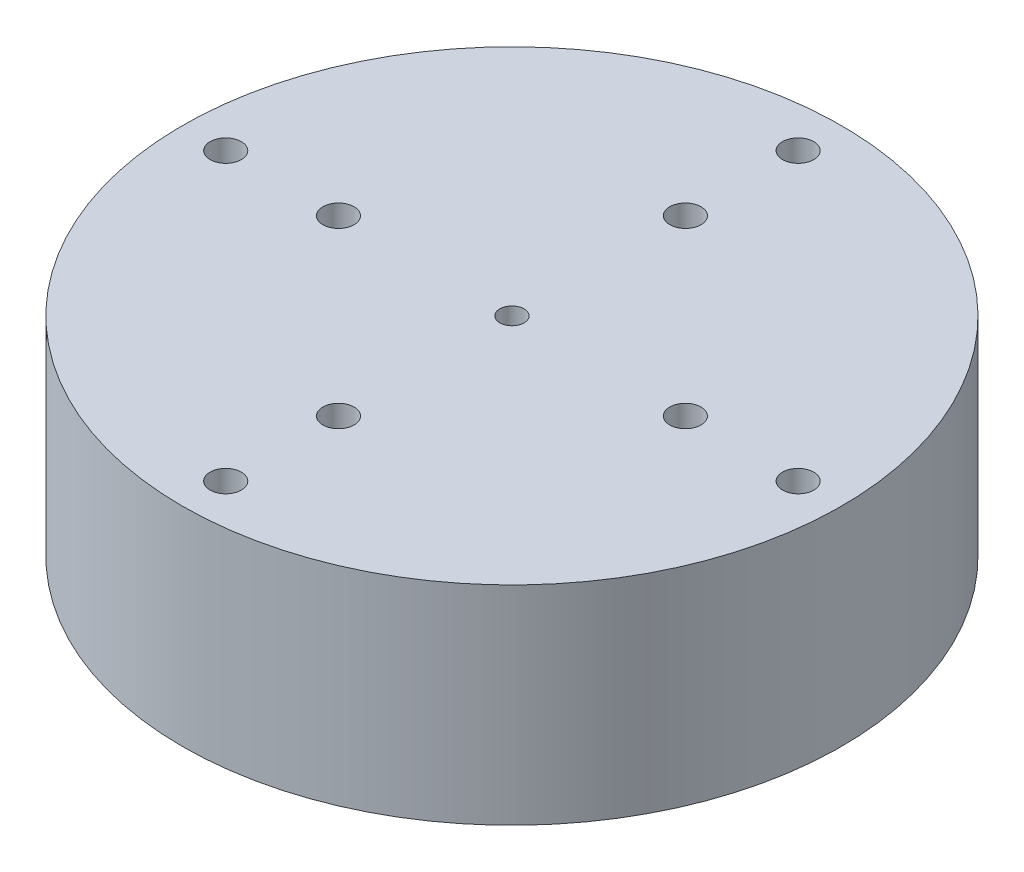
ISO-10303-21;
HEADER;
FILE_DESCRIPTION(('STEP AP214'),'2;1');
FILE_NAME('part.step','',(''),(''),'','','');
FILE_SCHEMA(('AUTOMOTIVE_DESIGN { 1 0 10303 214 1 1 1 1 }'));
ENDSEC;
DATA;
#1=APPLICATION_CONTEXT('core data for automotive mechanical design processes');
#2=APPLICATION_PROTOCOL_DEFINITION('international standard','automotive_design',2000,#1);
#3=PRODUCT_CONTEXT('',#1,'mechanical');
#4=PRODUCT('Part','Part','',(#3));
#5=PRODUCT_RELATED_PRODUCT_CATEGORY('part','',(#4));
#6=PRODUCT_DEFINITION_FORMATION('','',#4);
#7=PRODUCT_DEFINITION_CONTEXT('part definition',#1,'design');
#8=PRODUCT_DEFINITION('design','',#6,#7);
#9=PRODUCT_DEFINITION_SHAPE('','',#8);
#10=(LENGTH_UNIT() NAMED_UNIT(*) SI_UNIT(.MILLI.,.METRE.));
#11=(NAMED_UNIT(*) PLANE_ANGLE_UNIT() SI_UNIT($,.RADIAN.));
#12=(NAMED_UNIT(*) SI_UNIT($,.STERADIAN.) SOLID_ANGLE_UNIT());
#13=UNCERTAINTY_MEASURE_WITH_UNIT(LENGTH_MEASURE(1.E-05),#10,'distance_accuracy_value','');
#14=(GEOMETRIC_REPRESENTATION_CONTEXT(3) GLOBAL_UNCERTAINTY_ASSIGNED_CONTEXT((#13)) GLOBAL_UNIT_ASSIGNED_CONTEXT((#10,
#11,#12)) REPRESENTATION_CONTEXT('',''));
#15=CARTESIAN_POINT('',(0.,0.,0.));
#16=DIRECTION('',(0.,0.,1.));
#17=DIRECTION('',(1.,0.,0.));
#18=AXIS2_PLACEMENT_3D('',#15,#16,#17);
#19=CARTESIAN_POINT('',(0.,30.,0.));
#20=DIRECTION('',(0.,-1.,0.));
#21=DIRECTION('',(0.,0.,-1.));
#22=AXIS2_PLACEMENT_3D('',#19,#20,#21);
#23=CYLINDRICAL_SURFACE('',#22,35.);
#24=CARTESIAN_POINT('',(0.,0.,0.));
#25=DIRECTION('',(0.,1.,0.));
#26=DIRECTION('',(0.,0.,1.));
#27=AXIS2_PLACEMENT_3D('',#24,#25,#26);
#28=CIRCLE('',#27,35.);
#29=CARTESIAN_POINT('',(0.,0.,35.));
#30=VERTEX_POINT('',#29);
#31=EDGE_CURVE('E58',#30,#30,#28,.T.);
#32=ORIENTED_EDGE('',*,*,#31,.F.);
#33=EDGE_LOOP('',(#32));
#34=FACE_BOUND('',#33,.T.);
#35=CARTESIAN_POINT('',(0.,15.,0.));
#36=DIRECTION('',(0.,1.,0.));
#37=DIRECTION('',(0.,0.,1.));
#38=AXIS2_PLACEMENT_3D('',#35,#36,#37);
#39=CIRCLE('',#38,35.);
#40=CARTESIAN_POINT('',(0.,15.,35.));
#41=VERTEX_POINT('',#40);
#42=EDGE_CURVE('E67',#41,#41,#39,.T.);
#43=ORIENTED_EDGE('',*,*,#42,.T.);
#44=EDGE_LOOP('',(#43));
#45=FACE_BOUND('',#44,.T.);
#46=ADVANCED_FACE('F43',(#34,#45),#23,.F.);
#47=CARTESIAN_POINT('',(0.,30.,0.));
#48=DIRECTION('',(0.,1.,0.));
#49=DIRECTION('',(0.,0.,1.));
#50=AXIS2_PLACEMENT_3D('',#47,#48,#49);
#51=PLANE('',#50);
#52=CARTESIAN_POINT('',(-25.,30.,0.));
#53=DIRECTION('',(0.,1.,0.));
#54=DIRECTION('',(0.,0.,1.));
#55=AXIS2_PLACEMENT_3D('',#52,#53,#54);
#56=CIRCLE('',#55,2.25);
#57=CARTESIAN_POINT('',(-25.,30.,2.25));
#58=VERTEX_POINT('',#57);
#59=EDGE_CURVE('E230',#58,#58,#56,.T.);
#60=ORIENTED_EDGE('',*,*,#59,.F.);
#61=EDGE_LOOP('',(#60));
#62=FACE_BOUND('',#61,.T.);
#63=CARTESIAN_POINT('',(0.,30.,25.));
#64=DIRECTION('',(0.,1.,0.));
#65=DIRECTION('',(0.,0.,1.));
#66=AXIS2_PLACEMENT_3D('',#63,#64,#65);
#67=CIRCLE('',#66,2.25);
#68=CARTESIAN_POINT('',(0.,30.,27.25));
#69=VERTEX_POINT('',#68);
#70=EDGE_CURVE('E224',#69,#69,#67,.T.);
#71=ORIENTED_EDGE('',*,*,#70,.F.);
#72=EDGE_LOOP('',(#71));
#73=FACE_BOUND('',#72,.T.);
#74=CARTESIAN_POINT('',(25.,30.,0.));
#75=DIRECTION('',(0.,1.,0.));
#76=DIRECTION('',(0.,0.,1.));
#77=AXIS2_PLACEMENT_3D('',#74,#75,#76);
#78=CIRCLE('',#77,2.25);
#79=CARTESIAN_POINT('',(25.,30.,2.25));
#80=VERTEX_POINT('',#79);
#81=EDGE_CURVE('E211',#80,#80,#78,.T.);
#82=ORIENTED_EDGE('',*,*,#81,.F.);
#83=EDGE_LOOP('',(#82));
#84=FACE_BOUND('',#83,.T.);
#85=CARTESIAN_POINT('',(0.,30.,-25.));
#86=DIRECTION('',(0.,1.,0.));
#87=DIRECTION('',(0.,0.,1.));
#88=AXIS2_PLACEMENT_3D('',#85,#86,#87);
#89=CIRCLE('',#88,2.25);
#90=CARTESIAN_POINT('',(0.,30.,-22.75));
#91=VERTEX_POINT('',#90);
#92=EDGE_CURVE('E74',#91,#91,#89,.T.);
#93=ORIENTED_EDGE('',*,*,#92,.F.);
#94=EDGE_LOOP('',(#93));
#95=FACE_BOUND('',#94,.T.);
#96=CARTESIAN_POINT('',(0.,30.,0.));
#97=DIRECTION('',(0.,1.,0.));
#98=DIRECTION('',(0.,0.,1.));
#99=AXIS2_PLACEMENT_3D('',#96,#97,#98);
#100=CIRCLE('',#99,1.75);
#101=CARTESIAN_POINT('',(0.,30.,1.75));
#102=VERTEX_POINT('',#101);
#103=EDGE_CURVE('E68',#102,#102,#100,.T.);
#104=ORIENTED_EDGE('',*,*,#103,.F.);
#105=EDGE_LOOP('',(#104));
#106=FACE_BOUND('',#105,.T.);
#107=CARTESIAN_POINT('',(0.,30.,-41.25));
#108=DIRECTION('',(0.,1.,0.));
#109=DIRECTION('',(0.,0.,1.));
#110=AXIS2_PLACEMENT_3D('',#107,#108,#109);
#111=CIRCLE('',#110,2.25);
#112=CARTESIAN_POINT('',(0.,30.,-39.));
#113=VERTEX_POINT('',#112);
#114=EDGE_CURVE('E102',#113,#113,#111,.T.);
#115=ORIENTED_EDGE('',*,*,#114,.F.);
#116=EDGE_LOOP('',(#115));
#117=FACE_BOUND('',#116,.T.);
#118=CARTESIAN_POINT('',(41.25,30.,0.));
#119=DIRECTION('',(0.,1.,0.));
#120=DIRECTION('',(0.,0.,1.));
#121=AXIS2_PLACEMENT_3D('',#118,#119,#120);
#122=CIRCLE('',#121,2.25);
#123=CARTESIAN_POINT('',(41.25,30.,2.25));
#124=VERTEX_POINT('',#123);
#125=EDGE_CURVE('E106',#124,#124,#122,.T.);
#126=ORIENTED_EDGE('',*,*,#125,.F.);
#127=EDGE_LOOP('',(#126));
#128=FACE_BOUND('',#127,.T.);
#129=CARTESIAN_POINT('',(0.,30.,41.25));
#130=DIRECTION('',(0.,1.,0.));
#131=DIRECTION('',(0.,0.,-1.));
#132=AXIS2_PLACEMENT_3D('',#129,#130,#131);
#133=CIRCLE('',#132,2.25);
#134=CARTESIAN_POINT('',(0.,30.,39.));
#135=VERTEX_POINT('',#134);
#136=EDGE_CURVE('E122',#135,#135,#133,.T.);
#137=ORIENTED_EDGE('',*,*,#136,.F.);
#138=EDGE_LOOP('',(#137));
#139=FACE_BOUND('',#138,.T.);
#140=CARTESIAN_POINT('',(-41.25,30.,0.));
#141=DIRECTION('',(0.,1.,0.));
#142=DIRECTION('',(0.,0.,-1.));
#143=AXIS2_PLACEMENT_3D('',#140,#141,#142);
#144=CIRCLE('',#143,2.25);
#145=CARTESIAN_POINT('',(-41.25,30.,-2.25));
#146=VERTEX_POINT('',#145);
#147=EDGE_CURVE('E107',#146,#146,#144,.T.);
#148=ORIENTED_EDGE('',*,*,#147,.F.);
#149=EDGE_LOOP('',(#148));
#150=FACE_BOUND('',#149,.T.);
#151=CARTESIAN_POINT('',(0.,30.,0.));
#152=DIRECTION('',(0.,1.,0.));
#153=DIRECTION('',(0.,0.,1.));
#154=AXIS2_PLACEMENT_3D('',#151,#152,#153);
#155=CIRCLE('',#154,47.5);
#156=CARTESIAN_POINT('',(0.,30.,47.5));
#157=VERTEX_POINT('',#156);
#158=EDGE_CURVE('E10',#157,#157,#155,.T.);
#159=ORIENTED_EDGE('',*,*,#158,.T.);
#160=EDGE_LOOP('',(#159));
#161=FACE_BOUND('',#160,.T.);
#162=ADVANCED_FACE('F140',(#62,#73,#84,#95,#106,#117,#128,#139,#150,#161),#51,.T.);
#163=CARTESIAN_POINT('',(0.,0.,0.));
#164=DIRECTION('',(0.,1.,0.));
#165=DIRECTION('',(0.,0.,1.));
#166=AXIS2_PLACEMENT_3D('',#163,#164,#165);
#167=PLANE('',#166);
#168=CARTESIAN_POINT('',(0.,0.,-41.25));
#169=DIRECTION('',(0.,1.,0.));
#170=DIRECTION('',(0.,0.,1.));
#171=AXIS2_PLACEMENT_3D('',#168,#169,#170);
#172=CIRCLE('',#171,2.25);
#173=CARTESIAN_POINT('',(0.,0.,-39.));
#174=VERTEX_POINT('',#173);
#175=EDGE_CURVE('E98',#174,#174,#172,.T.);
#176=ORIENTED_EDGE('',*,*,#175,.T.);
#177=EDGE_LOOP('',(#176));
#178=FACE_BOUND('',#177,.T.);
#179=CARTESIAN_POINT('',(41.25,0.,0.));
#180=DIRECTION('',(0.,1.,0.));
#181=DIRECTION('',(0.,0.,1.));
#182=AXIS2_PLACEMENT_3D('',#179,#180,#181);
#183=CIRCLE('',#182,2.25);
#184=CARTESIAN_POINT('',(41.25,0.,2.25));
#185=VERTEX_POINT('',#184);
#186=EDGE_CURVE('E118',#185,#185,#183,.T.);
#187=ORIENTED_EDGE('',*,*,#186,.T.);
#188=EDGE_LOOP('',(#187));
#189=FACE_BOUND('',#188,.T.);
#190=CARTESIAN_POINT('',(0.,0.,41.25));
#191=DIRECTION('',(0.,1.,0.));
#192=DIRECTION('',(0.,0.,-1.));
#193=AXIS2_PLACEMENT_3D('',#190,#191,#192);
#194=CIRCLE('',#193,2.25);
#195=CARTESIAN_POINT('',(0.,0.,39.));
#196=VERTEX_POINT('',#195);
#197=EDGE_CURVE('E111',#196,#196,#194,.T.);
#198=ORIENTED_EDGE('',*,*,#197,.T.);
#199=EDGE_LOOP('',(#198));
#200=FACE_BOUND('',#199,.T.);
#201=CARTESIAN_POINT('',(-41.25,0.,0.));
#202=DIRECTION('',(0.,1.,0.));
#203=DIRECTION('',(0.,0.,-1.));
#204=AXIS2_PLACEMENT_3D('',#201,#202,#203);
#205=CIRCLE('',#204,2.25);
#206=CARTESIAN_POINT('',(-41.25,0.,-2.25));
#207=VERTEX_POINT('',#206);
#208=EDGE_CURVE('E97',#207,#207,#205,.T.);
#209=ORIENTED_EDGE('',*,*,#208,.T.);
#210=EDGE_LOOP('',(#209));
#211=FACE_BOUND('',#210,.T.);
#212=CARTESIAN_POINT('',(0.,0.,0.));
#213=DIRECTION('',(0.,1.,0.));
#214=DIRECTION('',(0.,0.,1.));
#215=AXIS2_PLACEMENT_3D('',#212,#213,#214);
#216=CIRCLE('',#215,47.5);
#217=CARTESIAN_POINT('',(0.,0.,47.5));
#218=VERTEX_POINT('',#217);
#219=EDGE_CURVE('E52',#218,#218,#216,.T.);
#220=ORIENTED_EDGE('',*,*,#219,.F.);
#221=EDGE_LOOP('',(#220));
#222=FACE_BOUND('',#221,.T.);
#223=ORIENTED_EDGE('',*,*,#31,.T.);
#224=EDGE_LOOP('',(#223));
#225=FACE_BOUND('',#224,.T.);
#226=ADVANCED_FACE('F129',(#178,#189,#200,#211,#222,#225),#167,.F.);
#227=CARTESIAN_POINT('',(0.,30.,0.));
#228=DIRECTION('',(0.,-1.,0.));
#229=DIRECTION('',(0.,0.,-1.));
#230=AXIS2_PLACEMENT_3D('',#227,#228,#229);
#231=CYLINDRICAL_SURFACE('',#230,47.5);
#232=ORIENTED_EDGE('',*,*,#158,.F.);
#233=EDGE_LOOP('',(#232));
#234=FACE_BOUND('',#233,.T.);
#235=ORIENTED_EDGE('',*,*,#219,.T.);
#236=EDGE_LOOP('',(#235));
#237=FACE_BOUND('',#236,.T.);
#238=ADVANCED_FACE('F45',(#234,#237),#231,.T.);
#239=CARTESIAN_POINT('',(-41.25,0.,0.));
#240=DIRECTION('',(0.,1.,0.));
#241=DIRECTION('',(0.,0.,1.));
#242=AXIS2_PLACEMENT_3D('',#239,#240,#241);
#243=CYLINDRICAL_SURFACE('',#242,2.25);
#244=ORIENTED_EDGE('',*,*,#208,.F.);
#245=EDGE_LOOP('',(#244));
#246=FACE_BOUND('',#245,.T.);
#247=ORIENTED_EDGE('',*,*,#147,.T.);
#248=EDGE_LOOP('',(#247));
#249=FACE_BOUND('',#248,.T.);
#250=ADVANCED_FACE('F136',(#246,#249),#243,.F.);
#251=CARTESIAN_POINT('',(0.,0.,41.25));
#252=DIRECTION('',(0.,1.,0.));
#253=DIRECTION('',(0.,0.,1.));
#254=AXIS2_PLACEMENT_3D('',#251,#252,#253);
#255=CYLINDRICAL_SURFACE('',#254,2.25);
#256=ORIENTED_EDGE('',*,*,#197,.F.);
#257=EDGE_LOOP('',(#256));
#258=FACE_BOUND('',#257,.T.);
#259=ORIENTED_EDGE('',*,*,#136,.T.);
#260=EDGE_LOOP('',(#259));
#261=FACE_BOUND('',#260,.T.);
#262=ADVANCED_FACE('F132',(#258,#261),#255,.F.);
#263=CARTESIAN_POINT('',(41.25,0.,0.));
#264=DIRECTION('',(0.,1.,0.));
#265=DIRECTION('',(0.,0.,1.));
#266=AXIS2_PLACEMENT_3D('',#263,#264,#265);
#267=CYLINDRICAL_SURFACE('',#266,2.25);
#268=ORIENTED_EDGE('',*,*,#186,.F.);
#269=EDGE_LOOP('',(#268));
#270=FACE_BOUND('',#269,.T.);
#271=ORIENTED_EDGE('',*,*,#125,.T.);
#272=EDGE_LOOP('',(#271));
#273=FACE_BOUND('',#272,.T.);
#274=ADVANCED_FACE('F135',(#270,#273),#267,.F.);
#275=CARTESIAN_POINT('',(0.,0.,-41.25));
#276=DIRECTION('',(0.,1.,0.));
#277=DIRECTION('',(0.,0.,1.));
#278=AXIS2_PLACEMENT_3D('',#275,#276,#277);
#279=CYLINDRICAL_SURFACE('',#278,2.25);
#280=ORIENTED_EDGE('',*,*,#175,.F.);
#281=EDGE_LOOP('',(#280));
#282=FACE_BOUND('',#281,.T.);
#283=ORIENTED_EDGE('',*,*,#114,.T.);
#284=EDGE_LOOP('',(#283));
#285=FACE_BOUND('',#284,.T.);
#286=ADVANCED_FACE('F176',(#282,#285),#279,.F.);
#287=CARTESIAN_POINT('',(0.,15.,0.));
#288=DIRECTION('',(0.,1.,0.));
#289=DIRECTION('',(0.,0.,1.));
#290=AXIS2_PLACEMENT_3D('',#287,#288,#289);
#291=PLANE('',#290);
#292=CARTESIAN_POINT('',(-25.,15.,0.));
#293=DIRECTION('',(0.,1.,0.));
#294=DIRECTION('',(0.,0.,1.));
#295=AXIS2_PLACEMENT_3D('',#292,#293,#294);
#296=CIRCLE('',#295,2.25);
#297=CARTESIAN_POINT('',(-25.,15.,2.25));
#298=VERTEX_POINT('',#297);
#299=EDGE_CURVE('E47',#298,#298,#296,.T.);
#300=ORIENTED_EDGE('',*,*,#299,.T.);
#301=EDGE_LOOP('',(#300));
#302=FACE_BOUND('',#301,.T.);
#303=CARTESIAN_POINT('',(0.,15.,25.));
#304=DIRECTION('',(0.,1.,0.));
#305=DIRECTION('',(0.,0.,1.));
#306=AXIS2_PLACEMENT_3D('',#303,#304,#305);
#307=CIRCLE('',#306,2.25);
#308=CARTESIAN_POINT('',(0.,15.,27.25));
#309=VERTEX_POINT('',#308);
#310=EDGE_CURVE('E77',#309,#309,#307,.T.);
#311=ORIENTED_EDGE('',*,*,#310,.T.);
#312=EDGE_LOOP('',(#311));
#313=FACE_BOUND('',#312,.T.);
#314=CARTESIAN_POINT('',(25.,15.,0.));
#315=DIRECTION('',(0.,1.,0.));
#316=DIRECTION('',(0.,0.,1.));
#317=AXIS2_PLACEMENT_3D('',#314,#315,#316);
#318=CIRCLE('',#317,2.25);
#319=CARTESIAN_POINT('',(25.,15.,2.25));
#320=VERTEX_POINT('',#319);
#321=EDGE_CURVE('E73',#320,#320,#318,.T.);
#322=ORIENTED_EDGE('',*,*,#321,.T.);
#323=EDGE_LOOP('',(#322));
#324=FACE_BOUND('',#323,.T.);
#325=CARTESIAN_POINT('',(0.,15.,-25.));
#326=DIRECTION('',(0.,1.,0.));
#327=DIRECTION('',(0.,0.,1.));
#328=AXIS2_PLACEMENT_3D('',#325,#326,#327);
#329=CIRCLE('',#328,2.25);
#330=CARTESIAN_POINT('',(0.,15.,-22.75));
#331=VERTEX_POINT('',#330);
#332=EDGE_CURVE('E69',#331,#331,#329,.T.);
#333=ORIENTED_EDGE('',*,*,#332,.T.);
#334=EDGE_LOOP('',(#333));
#335=FACE_BOUND('',#334,.T.);
#336=CARTESIAN_POINT('',(0.,15.,0.));
#337=DIRECTION('',(0.,1.,0.));
#338=DIRECTION('',(0.,0.,1.));
#339=AXIS2_PLACEMENT_3D('',#336,#337,#338);
#340=CIRCLE('',#339,1.75);
#341=CARTESIAN_POINT('',(0.,15.,1.75));
#342=VERTEX_POINT('',#341);
#343=EDGE_CURVE('E63',#342,#342,#340,.T.);
#344=ORIENTED_EDGE('',*,*,#343,.T.);
#345=EDGE_LOOP('',(#344));
#346=FACE_BOUND('',#345,.T.);
#347=ORIENTED_EDGE('',*,*,#42,.F.);
#348=EDGE_LOOP('',(#347));
#349=FACE_BOUND('',#348,.T.);
#350=ADVANCED_FACE('F181',(#302,#313,#324,#335,#346,#349),#291,.F.);
#351=CARTESIAN_POINT('',(0.,0.,0.));
#352=DIRECTION('',(0.,1.,0.));
#353=DIRECTION('',(0.,0.,1.));
#354=AXIS2_PLACEMENT_3D('',#351,#352,#353);
#355=CYLINDRICAL_SURFACE('',#354,1.75);
#356=ORIENTED_EDGE('',*,*,#103,.T.);
#357=EDGE_LOOP('',(#356));
#358=FACE_BOUND('',#357,.T.);
#359=ORIENTED_EDGE('',*,*,#343,.F.);
#360=EDGE_LOOP('',(#359));
#361=FACE_BOUND('',#360,.T.);
#362=ADVANCED_FACE('F186',(#358,#361),#355,.F.);
#363=CARTESIAN_POINT('',(0.,0.,-25.));
#364=DIRECTION('',(0.,1.,0.));
#365=DIRECTION('',(0.,0.,1.));
#366=AXIS2_PLACEMENT_3D('',#363,#364,#365);
#367=CYLINDRICAL_SURFACE('',#366,2.25);
#368=ORIENTED_EDGE('',*,*,#92,.T.);
#369=EDGE_LOOP('',(#368));
#370=FACE_BOUND('',#369,.T.);
#371=ORIENTED_EDGE('',*,*,#332,.F.);
#372=EDGE_LOOP('',(#371));
#373=FACE_BOUND('',#372,.T.);
#374=ADVANCED_FACE('F191',(#370,#373),#367,.F.);
#375=CARTESIAN_POINT('',(25.,0.,0.));
#376=DIRECTION('',(0.,1.,0.));
#377=DIRECTION('',(0.,0.,1.));
#378=AXIS2_PLACEMENT_3D('',#375,#376,#377);
#379=CYLINDRICAL_SURFACE('',#378,2.25);
#380=ORIENTED_EDGE('',*,*,#81,.T.);
#381=EDGE_LOOP('',(#380));
#382=FACE_BOUND('',#381,.T.);
#383=ORIENTED_EDGE('',*,*,#321,.F.);
#384=EDGE_LOOP('',(#383));
#385=FACE_BOUND('',#384,.T.);
#386=ADVANCED_FACE('F194',(#382,#385),#379,.F.);
#387=CARTESIAN_POINT('',(0.,0.,25.));
#388=DIRECTION('',(0.,1.,0.));
#389=DIRECTION('',(0.,0.,1.));
#390=AXIS2_PLACEMENT_3D('',#387,#388,#389);
#391=CYLINDRICAL_SURFACE('',#390,2.25);
#392=ORIENTED_EDGE('',*,*,#70,.T.);
#393=EDGE_LOOP('',(#392));
#394=FACE_BOUND('',#393,.T.);
#395=ORIENTED_EDGE('',*,*,#310,.F.);
#396=EDGE_LOOP('',(#395));
#397=FACE_BOUND('',#396,.T.);
#398=ADVANCED_FACE('F199',(#394,#397),#391,.F.);
#399=CARTESIAN_POINT('',(-25.,0.,0.));
#400=DIRECTION('',(0.,1.,0.));
#401=DIRECTION('',(0.,0.,1.));
#402=AXIS2_PLACEMENT_3D('',#399,#400,#401);
#403=CYLINDRICAL_SURFACE('',#402,2.25);
#404=ORIENTED_EDGE('',*,*,#59,.T.);
#405=EDGE_LOOP('',(#404));
#406=FACE_BOUND('',#405,.T.);
#407=ORIENTED_EDGE('',*,*,#299,.F.);
#408=EDGE_LOOP('',(#407));
#409=FACE_BOUND('',#408,.T.);
#410=ADVANCED_FACE('F196',(#406,#409),#403,.F.);
#411=CLOSED_SHELL('',(#46,#162,#226,#238,#250,#262,#274,#286,#350,#362,#374,#386,#398,#410));
#412=MANIFOLD_SOLID_BREP('B2',#411);
#413=ADVANCED_BREP_SHAPE_REPRESENTATION('',(#18,#412),#14);
#414=SHAPE_DEFINITION_REPRESENTATION(#9,#413);
ENDSEC;
END-ISO-10303-21;
